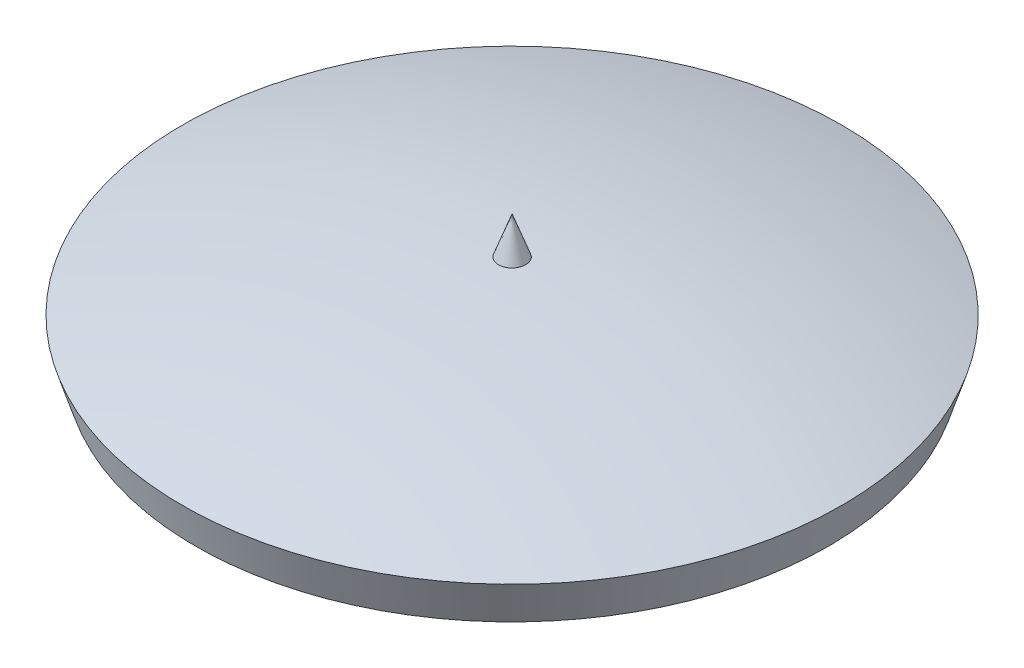
ISO-10303-21;
HEADER;
FILE_DESCRIPTION(('STEP AP214'),'2;1');
FILE_NAME('part.step','',(''),(''),'','','');
FILE_SCHEMA(('AUTOMOTIVE_DESIGN { 1 0 10303 214 1 1 1 1 }'));
ENDSEC;
DATA;
#1=APPLICATION_CONTEXT('core data for automotive mechanical design processes');
#2=APPLICATION_PROTOCOL_DEFINITION('international standard','automotive_design',2000,#1);
#3=PRODUCT_CONTEXT('',#1,'mechanical');
#4=PRODUCT('Part','Part','',(#3));
#5=PRODUCT_RELATED_PRODUCT_CATEGORY('part','',(#4));
#6=PRODUCT_DEFINITION_FORMATION('','',#4);
#7=PRODUCT_DEFINITION_CONTEXT('part definition',#1,'design');
#8=PRODUCT_DEFINITION('design','',#6,#7);
#9=PRODUCT_DEFINITION_SHAPE('','',#8);
#10=(LENGTH_UNIT() NAMED_UNIT(*) SI_UNIT(.MILLI.,.METRE.));
#11=(NAMED_UNIT(*) PLANE_ANGLE_UNIT() SI_UNIT($,.RADIAN.));
#12=(NAMED_UNIT(*) SI_UNIT($,.STERADIAN.) SOLID_ANGLE_UNIT());
#13=UNCERTAINTY_MEASURE_WITH_UNIT(LENGTH_MEASURE(1.E-05),#10,'distance_accuracy_value','');
#14=(GEOMETRIC_REPRESENTATION_CONTEXT(3) GLOBAL_UNCERTAINTY_ASSIGNED_CONTEXT((#13)) GLOBAL_UNIT_ASSIGNED_CONTEXT((#10,
#11,#12)) REPRESENTATION_CONTEXT('',''));
#15=CARTESIAN_POINT('',(0.,0.,0.));
#16=DIRECTION('',(0.,0.,1.));
#17=DIRECTION('',(1.,0.,0.));
#18=AXIS2_PLACEMENT_3D('',#15,#16,#17);
#19=CARTESIAN_POINT('',(0.,195.696994377887,0.));
#20=DIRECTION('',(0.,1.,0.));
#21=DIRECTION('',(0.,0.,1.));
#22=AXIS2_PLACEMENT_3D('',#19,#20,#21);
#23=PLANE('',#22);
#24=CARTESIAN_POINT('',(0.,195.696994377887,0.));
#25=DIRECTION('',(0.,-1.,0.));
#26=DIRECTION('',(0.,0.,-1.));
#27=AXIS2_PLACEMENT_3D('',#24,#25,#26);
#28=CIRCLE('',#27,12.573);
#29=CARTESIAN_POINT('',(0.,195.696994377887,-12.573));
#30=VERTEX_POINT('',#29);
#31=EDGE_CURVE('E11',#30,#30,#28,.T.);
#32=ORIENTED_EDGE('',*,*,#31,.F.);
#33=EDGE_LOOP('',(#32));
#34=FACE_BOUND('',#33,.T.);
#35=CARTESIAN_POINT('',(0.,195.696994428401,-18.2880000000001));
#36=CARTESIAN_POINT('',(-0.295483389992222,195.696994428401,-18.2880000000001));
#37=CARTESIAN_POINT('',(-0.886450169976665,195.696996332591,-18.2741390345859));
#38=CARTESIAN_POINT('',(-2.96929679432866,195.696991629222,-18.1212044470448));
#39=CARTESIAN_POINT('',(-6.65094635453992,195.6969955545,-17.3457822350714));
#40=CARTESIAN_POINT('',(-12.1666723448103,195.69699412507,-14.2288427643412));
#41=CARTESIAN_POINT('',(-16.9412541257495,195.696994515625,-8.31539798132601));
#42=CARTESIAN_POINT('',(-18.9405432159816,195.696994382838,-0.0964932499068932));
#43=CARTESIAN_POINT('',(-17.023201418897,195.696994523431,8.15273440993213));
#44=CARTESIAN_POINT('',(-12.2872172393601,195.696994093844,14.1295169281421));
#45=CARTESIAN_POINT('',(-6.77038187830294,195.696995671601,17.3025633267696));
#46=CARTESIAN_POINT('',(-3.05613579156695,195.696991316185,18.108377197913));
#47=CARTESIAN_POINT('',(-0.934121699745622,195.696996664194,18.2726318032283));
#48=CARTESIAN_POINT('',(-0.311373899915209,195.696994428401,18.2880000000001));
#49=CARTESIAN_POINT('',(0.311373899915203,195.696994428401,18.2880000000001));
#50=CARTESIAN_POINT('',(0.934121699745617,195.696996664194,18.2726318032283));
#51=CARTESIAN_POINT('',(3.05613579156694,195.696991316185,18.108377197913));
#52=CARTESIAN_POINT('',(6.77038187830294,195.696995671601,17.3025633267696));
#53=CARTESIAN_POINT('',(12.2872172393601,195.696994093844,14.1295169281421));
#54=CARTESIAN_POINT('',(17.023201418897,195.696994523431,8.15273440993212));
#55=CARTESIAN_POINT('',(18.9405432159816,195.696994382838,-0.0964932499068849));
#56=CARTESIAN_POINT('',(16.9412541257495,195.696994515625,-8.315397981326));
#57=CARTESIAN_POINT('',(12.1666723448104,195.696994125071,-14.2288427643412));
#58=CARTESIAN_POINT('',(6.65094635453993,195.6969955545,-17.3457822350713));
#59=CARTESIAN_POINT('',(2.96929679432867,195.696991629222,-18.1212044470448));
#60=CARTESIAN_POINT('',(0.886450169976672,195.696996332591,-18.2741390345859));
#61=CARTESIAN_POINT('',(0.295483389992225,195.696994428401,-18.2880000000001));
#62=CARTESIAN_POINT('',(0.,195.696994428401,-18.2880000000001));
#63=(BOUNDED_CURVE() B_SPLINE_CURVE(3,(#35,#36,#37,#38,#39,#40,#41,#42,#43,#44,#45,#46,#47,#48,
#49,#50,#51,#52,#53,#54,#55,#56,#57,#58,#59,#60,#61,#62),.UNSPECIFIED.,.T.,
.F.) B_SPLINE_CURVE_WITH_KNOTS((4,1,1,1,1,1,1,1,1,1,1,1,2,1,1,1,1,1,1,1,1,1,1,1,4),(0.,0.011875,
0.0237499999999999,0.0801562499999999,0.1365625,0.19296875,0.249375,0.30578125,0.3621875,
0.41859375,0.475,0.4875,0.5,0.5125,0.525,0.58140625,0.6378125,0.69421875,0.750625,0.80703125,
0.8634375,0.91984375,0.97625,0.988125,1.),
.UNSPECIFIED.) CURVE() GEOMETRIC_REPRESENTATION_ITEM() RATIONAL_B_SPLINE_CURVE((1.,1.,
0.999999999999998,0.999999999999987,0.999999999999972,0.999999999999957,0.999999999999948,
0.999999999999945,0.999999999999948,0.999999999999957,0.999999999999971,0.999999999999986,
0.999999999999998,1.,1.,0.999999999999998,0.999999999999986,0.999999999999971,0.999999999999957,
0.999999999999948,0.999999999999945,0.999999999999948,0.999999999999957,0.999999999999972,
0.999999999999987,0.999999999999998,1.,1.)) REPRESENTATION_ITEM(''));
#64=CARTESIAN_POINT('',(0.,195.696994428401,-18.2880000000001));
#65=VERTEX_POINT('',#64);
#66=EDGE_CURVE('E103',#65,#65,#63,.F.);
#67=ORIENTED_EDGE('',*,*,#66,.T.);
#68=EDGE_LOOP('',(#67));
#69=FACE_BOUND('',#68,.T.);
#70=ADVANCED_FACE('F40',(#34,#69),#23,.F.);
#71=CARTESIAN_POINT('',(0.,198.12,-19.05));
#72=CARTESIAN_POINT('',(0.,195.696994428401,-18.288));
#73=CARTESIAN_POINT('',(-0.311488812392426,198.12,-19.05));
#74=CARTESIAN_POINT('',(-0.29548338999222,195.696994428401,-18.288));
#75=CARTESIAN_POINT('',(-0.934220683143885,198.12,-19.0349702006946));
#76=CARTESIAN_POINT('',(-0.886450169976659,195.69699633259,-18.2741390345858));
#77=CARTESIAN_POINT('',(-3.25700243860863,198.12,-18.8633589371484));
#78=CARTESIAN_POINT('',(-2.96929679432863,195.696991629221,-18.1212044470447));
#79=CARTESIAN_POINT('',(-7.32442035999108,198.12,-17.9181218320689));
#80=CARTESIAN_POINT('',(-6.65094635453987,195.6969955545,-17.3457822350713));
#81=CARTESIAN_POINT('',(-12.995885474466,198.12,-14.540820534039));
#82=CARTESIAN_POINT('',(-12.1666723448103,195.69699412507,-14.2288427643412));
#83=CARTESIAN_POINT('',(-17.7590287588149,198.12,-8.39705968560465));
#84=CARTESIAN_POINT('',(-16.9412541257495,195.696994515624,-8.315397981326));
#85=CARTESIAN_POINT('',(-19.7074279175923,198.12,-0.0968935697939849));
#86=CARTESIAN_POINT('',(-18.9405432159815,195.696994382837,-0.0964932499068932));
#87=CARTESIAN_POINT('',(-17.8394403523135,198.12,8.23095637860996));
#88=CARTESIAN_POINT('',(-17.0232014188969,195.696994523431,8.15273440993212));
#89=CARTESIAN_POINT('',(-13.1179777745799,198.12,14.4353800263427));
#90=CARTESIAN_POINT('',(-12.2872172393601,195.696994093843,14.129516928142));
#91=CARTESIAN_POINT('',(-7.44858246421386,198.12,17.8699815493042));
#92=CARTESIAN_POINT('',(-6.77038187830289,195.696995671601,17.3025633267696));
#93=CARTESIAN_POINT('',(-3.35037235964553,198.12,18.8489799917934));
#94=CARTESIAN_POINT('',(-3.05613579156692,195.696991316185,18.1083771979129));
#95=CARTESIAN_POINT('',(-0.985056967572308,198.12,19.0333041191937));
#96=CARTESIAN_POINT('',(-0.934121699745616,195.696996664193,18.2726318032282));
#97=CARTESIAN_POINT('',(-0.328448275862072,198.12,19.05));
#98=CARTESIAN_POINT('',(-0.311373899915207,195.696994428401,18.288));
#99=CARTESIAN_POINT('',(0.328448275862066,198.12,19.05));
#100=CARTESIAN_POINT('',(0.311373899915201,195.696994428401,18.288));
#101=CARTESIAN_POINT('',(0.985056967572303,198.12,19.0333041191937));
#102=CARTESIAN_POINT('',(0.934121699745612,195.696996664193,18.2726318032282));
#103=CARTESIAN_POINT('',(3.35037235964552,198.12,18.8489799917934));
#104=CARTESIAN_POINT('',(3.05613579156691,195.696991316185,18.1083771979129));
#105=CARTESIAN_POINT('',(7.44858246421386,198.12,17.8699815493042));
#106=CARTESIAN_POINT('',(6.77038187830289,195.696995671601,17.3025633267696));
#107=CARTESIAN_POINT('',(13.1179777745799,198.12,14.4353800263427));
#108=CARTESIAN_POINT('',(12.2872172393601,195.696994093843,14.129516928142));
#109=CARTESIAN_POINT('',(17.8394403523135,198.12,8.23095637860996));
#110=CARTESIAN_POINT('',(17.023201418897,195.696994523431,8.15273440993212));
#111=CARTESIAN_POINT('',(19.7074279175923,198.12,-0.0968935697939778));
#112=CARTESIAN_POINT('',(18.9405432159815,195.696994382837,-0.0964932499068849));
#113=CARTESIAN_POINT('',(17.7590287588149,198.12,-8.39705968560464));
#114=CARTESIAN_POINT('',(16.9412541257495,195.696994515624,-8.31539798132599));
#115=CARTESIAN_POINT('',(12.995885474466,198.12,-14.540820534039));
#116=CARTESIAN_POINT('',(12.1666723448103,195.69699412507,-14.2288427643412));
#117=CARTESIAN_POINT('',(7.32442035999109,198.12,-17.9181218320689));
#118=CARTESIAN_POINT('',(6.65094635453988,195.6969955545,-17.3457822350713));
#119=CARTESIAN_POINT('',(3.25700243860864,198.12,-18.8633589371484));
#120=CARTESIAN_POINT('',(2.96929679432864,195.696991629221,-18.1212044470447));
#121=CARTESIAN_POINT('',(0.934220683143891,198.12,-19.0349702006946));
#122=CARTESIAN_POINT('',(0.886450169976667,195.69699633259,-18.2741390345858));
#123=CARTESIAN_POINT('',(0.311488812392429,198.12,-19.05));
#124=CARTESIAN_POINT('',(0.295483389992223,195.696994428401,-18.288));
#125=CARTESIAN_POINT('',(0.,198.12,-19.05));
#126=CARTESIAN_POINT('',(0.,195.696994428401,-18.288));
#127=(BOUNDED_SURFACE() B_SPLINE_SURFACE(3,1,((#71,#72),(#73,#74),(#75,#76),(#77,#78),(#79,#80),
(#81,#82),(#83,#84),(#85,#86),(#87,#88),(#89,#90),(#91,#92),(#93,#94),(#95,#96),(#97,#98),(#99,
#100),(#101,#102),(#103,#104),(#105,#106),(#107,#108),(#109,#110),(#111,#112),(#113,#114),(#115,
#116),(#117,#118),(#119,#120),(#121,#122),(#123,#124),(#125,#126)),.UNSPECIFIED.,.T.,.F.,
.F.) B_SPLINE_SURFACE_WITH_KNOTS((4,1,1,1,1,1,1,1,1,1,1,1,2,1,1,1,1,1,1,1,1,1,1,1,4),(2,2),(0.,
0.011875,0.0237499999999999,0.0801562499999999,0.1365625,0.19296875,0.249375,0.30578125,
0.3621875,0.41859375,0.475,0.4875,0.5,0.5125,0.525,0.58140625,0.6378125,0.69421875,0.750625,
0.80703125,0.8634375,0.91984375,0.97625,0.988125,1.),(0.,1.),
.UNSPECIFIED.) GEOMETRIC_REPRESENTATION_ITEM() RATIONAL_B_SPLINE_SURFACE(((1.,1.),(1.,1.),
(0.984425559380379,1.),(0.881919373924269,1.),(0.745911279044751,1.),(0.613900266243546,1.),
(0.534460655120482,1.),(0.507592445675559,1.),(0.533295637908778,1.),(0.611570231820138,1.),
(0.742416227409639,1.),(0.878243330464716,1.),(0.981927710843374,1.),(0.998278829604131,1.),
(0.998278829604131,1.),(0.981927710843374,1.),(0.878243330464716,1.),(0.742416227409639,1.),
(0.611570231820138,1.),(0.533295637908778,1.),(0.50759244567556,1.),(0.534460655120482,1.),
(0.613900266243546,1.),(0.74591127904475,1.),(0.881919373924268,1.),(0.984425559380379,1.),(1.,
1.),(1.,1.))) REPRESENTATION_ITEM('') SURFACE());
#128=CARTESIAN_POINT('',(0.,198.12,-19.05));
#129=CARTESIAN_POINT('',(0.311488812392429,198.12,-19.05));
#130=CARTESIAN_POINT('',(0.934220683143891,198.12,-19.0349702006946));
#131=CARTESIAN_POINT('',(3.25700243860864,198.12,-18.8633589371484));
#132=CARTESIAN_POINT('',(7.32442035999109,198.12,-17.9181218320689));
#133=CARTESIAN_POINT('',(12.995885474466,198.12,-14.540820534039));
#134=CARTESIAN_POINT('',(17.7590287588149,198.12,-8.39705968560464));
#135=CARTESIAN_POINT('',(19.7074279175923,198.12,-0.0968935697939778));
#136=CARTESIAN_POINT('',(17.8394403523135,198.12,8.23095637860996));
#137=CARTESIAN_POINT('',(13.1179777745799,198.12,14.4353800263427));
#138=CARTESIAN_POINT('',(7.44858246421386,198.12,17.8699815493042));
#139=CARTESIAN_POINT('',(3.35037235964552,198.12,18.8489799917934));
#140=CARTESIAN_POINT('',(0.985056967572303,198.12,19.0333041191937));
#141=CARTESIAN_POINT('',(0.328448275862066,198.12,19.05));
#142=CARTESIAN_POINT('',(-0.328448275862072,198.12,19.05));
#143=CARTESIAN_POINT('',(-0.985056967572308,198.12,19.0333041191937));
#144=CARTESIAN_POINT('',(-3.35037235964553,198.12,18.8489799917934));
#145=CARTESIAN_POINT('',(-7.44858246421386,198.12,17.8699815493042));
#146=CARTESIAN_POINT('',(-13.1179777745799,198.12,14.4353800263427));
#147=CARTESIAN_POINT('',(-17.8394403523135,198.12,8.23095637860996));
#148=CARTESIAN_POINT('',(-19.7074279175923,198.12,-0.0968935697939849));
#149=CARTESIAN_POINT('',(-17.7590287588149,198.12,-8.39705968560465));
#150=CARTESIAN_POINT('',(-12.995885474466,198.12,-14.540820534039));
#151=CARTESIAN_POINT('',(-7.32442035999108,198.12,-17.9181218320689));
#152=CARTESIAN_POINT('',(-3.25700243860863,198.12,-18.8633589371484));
#153=CARTESIAN_POINT('',(-0.934220683143885,198.12,-19.0349702006946));
#154=CARTESIAN_POINT('',(-0.311488812392426,198.12,-19.05));
#155=CARTESIAN_POINT('',(0.,198.12,-19.05));
#156=(BOUNDED_CURVE() B_SPLINE_CURVE(3,(#128,#129,#130,#131,#132,#133,#134,#135,#136,#137,#138,
#139,#140,#141,#142,#143,#144,#145,#146,#147,#148,#149,#150,#151,#152,#153,#154,#155),
.UNSPECIFIED.,.T.,.F.) B_SPLINE_CURVE_WITH_KNOTS((4,1,1,1,1,1,1,1,1,1,1,1,2,1,1,1,1,1,1,1,1,1,1,
1,4),(0.,0.0118750000000001,0.02375,0.08015625,0.1365625,0.19296875,0.249375,0.30578125,
0.3621875,0.41859375,0.475,0.4875,0.5,0.5125,0.525,0.58140625,0.6378125,0.69421875,0.750625,
0.80703125,0.8634375,0.91984375,0.97625,0.988125,1.),
.UNSPECIFIED.) CURVE() GEOMETRIC_REPRESENTATION_ITEM() RATIONAL_B_SPLINE_CURVE((1.,1.,
0.984425559380379,0.881919373924268,0.74591127904475,0.613900266243546,0.534460655120482,
0.50759244567556,0.533295637908778,0.611570231820138,0.742416227409639,0.878243330464716,
0.981927710843374,0.998278829604131,0.998278829604131,0.981927710843374,0.878243330464716,
0.742416227409639,0.611570231820138,0.533295637908778,0.507592445675559,0.534460655120482,
0.613900266243546,0.745911279044751,0.881919373924269,0.984425559380379,1.,1.)) REPRESENTATION_ITEM(''));
#157=CARTESIAN_POINT('',(0.,198.12,-19.05));
#158=VERTEX_POINT('',#157);
#159=EDGE_CURVE('E90',#158,#158,#156,.T.);
#160=ORIENTED_EDGE('',*,*,#159,.T.);
#161=EDGE_LOOP('',(#160));
#162=FACE_BOUND('',#161,.T.);
#163=ORIENTED_EDGE('',*,*,#66,.F.);
#164=EDGE_LOOP('',(#163));
#165=FACE_BOUND('',#164,.T.);
#166=ADVANCED_FACE('F66',(#162,#165),#127,.F.);
#167=CARTESIAN_POINT('',(0.,137.544860710024,0.));
#168=DIRECTION('',(0.,-1.,0.));
#169=DIRECTION('',(1.,0.,0.));
#170=AXIS2_PLACEMENT_3D('',#167,#168,#169);
#171=SPHERICAL_SURFACE('',#170,63.5);
#172=CARTESIAN_POINT('',(0.,201.039993784949,0.));
#173=DIRECTION('',(0.,-1.,0.));
#174=DIRECTION('',(0.,0.,-1.));
#175=AXIS2_PLACEMENT_3D('',#172,#173,#174);
#176=CIRCLE('',#175,0.786177968108663);
#177=CARTESIAN_POINT('',(0.,201.039993784949,-0.786177968108663));
#178=VERTEX_POINT('',#177);
#179=EDGE_CURVE('E49',#178,#178,#176,.T.);
#180=ORIENTED_EDGE('',*,*,#179,.T.);
#181=EDGE_LOOP('',(#180));
#182=FACE_BOUND('',#181,.T.);
#183=ORIENTED_EDGE('',*,*,#159,.F.);
#184=EDGE_LOOP('',(#183));
#185=FACE_BOUND('',#184,.T.);
#186=ADVANCED_FACE('F56',(#182,#185),#171,.T.);
#187=CARTESIAN_POINT('',(0.,203.200000000005,0.));
#188=DIRECTION('',(0.,-1.,0.));
#189=DIRECTION('',(0.,0.,-1.));
#190=AXIS2_PLACEMENT_3D('',#187,#188,#189);
#191=CONICAL_SURFACE('',#190,0.,0.349065850398215);
#192=ORIENTED_EDGE('',*,*,#179,.F.);
#193=EDGE_LOOP('',(#192));
#194=FACE_BOUND('',#193,.T.);
#195=CARTESIAN_POINT('',(0.,203.200000000005,0.));
#196=VERTEX_POINT('',#195);
#197=VERTEX_LOOP('',#196);
#198=FACE_BOUND('',#197,.T.);
#199=ADVANCED_FACE('F53',(#194,#198),#191,.T.);
#200=CARTESIAN_POINT('',(0.,157.595180138453,0.));
#201=DIRECTION('',(0.,1.,0.));
#202=DIRECTION('',(0.,0.,1.));
#203=AXIS2_PLACEMENT_3D('',#200,#201,#202);
#204=CYLINDRICAL_SURFACE('',#203,12.573);
#205=CARTESIAN_POINT('',(0.,193.156994377887,0.));
#206=DIRECTION('',(0.,1.,0.));
#207=DIRECTION('',(0.,0.,1.));
#208=AXIS2_PLACEMENT_3D('',#205,#206,#207);
#209=CIRCLE('',#208,12.573);
#210=CARTESIAN_POINT('',(0.,193.156994377887,12.573));
#211=VERTEX_POINT('',#210);
#212=EDGE_CURVE('E113',#211,#211,#209,.T.);
#213=ORIENTED_EDGE('',*,*,#212,.T.);
#214=EDGE_LOOP('',(#213));
#215=FACE_BOUND('',#214,.T.);
#216=ORIENTED_EDGE('',*,*,#31,.T.);
#217=EDGE_LOOP('',(#216));
#218=FACE_BOUND('',#217,.T.);
#219=ADVANCED_FACE('F55',(#215,#218),#204,.T.);
#220=CARTESIAN_POINT('',(0.,193.156994377887,0.));
#221=DIRECTION('',(0.,1.,0.));
#222=DIRECTION('',(0.,0.,1.));
#223=AXIS2_PLACEMENT_3D('',#220,#221,#222);
#224=PLANE('',#223);
#225=ORIENTED_EDGE('',*,*,#212,.F.);
#226=EDGE_LOOP('',(#225));
#227=FACE_BOUND('',#226,.T.);
#228=ADVANCED_FACE('F63',(#227),#224,.F.);
#229=CLOSED_SHELL('',(#70,#166,#186,#199,#219,#228));
#230=MANIFOLD_SOLID_BREP('B2',#229);
#231=ADVANCED_BREP_SHAPE_REPRESENTATION('',(#18,#230),#14);
#232=SHAPE_DEFINITION_REPRESENTATION(#9,#231);
ENDSEC;
END-ISO-10303-21;
